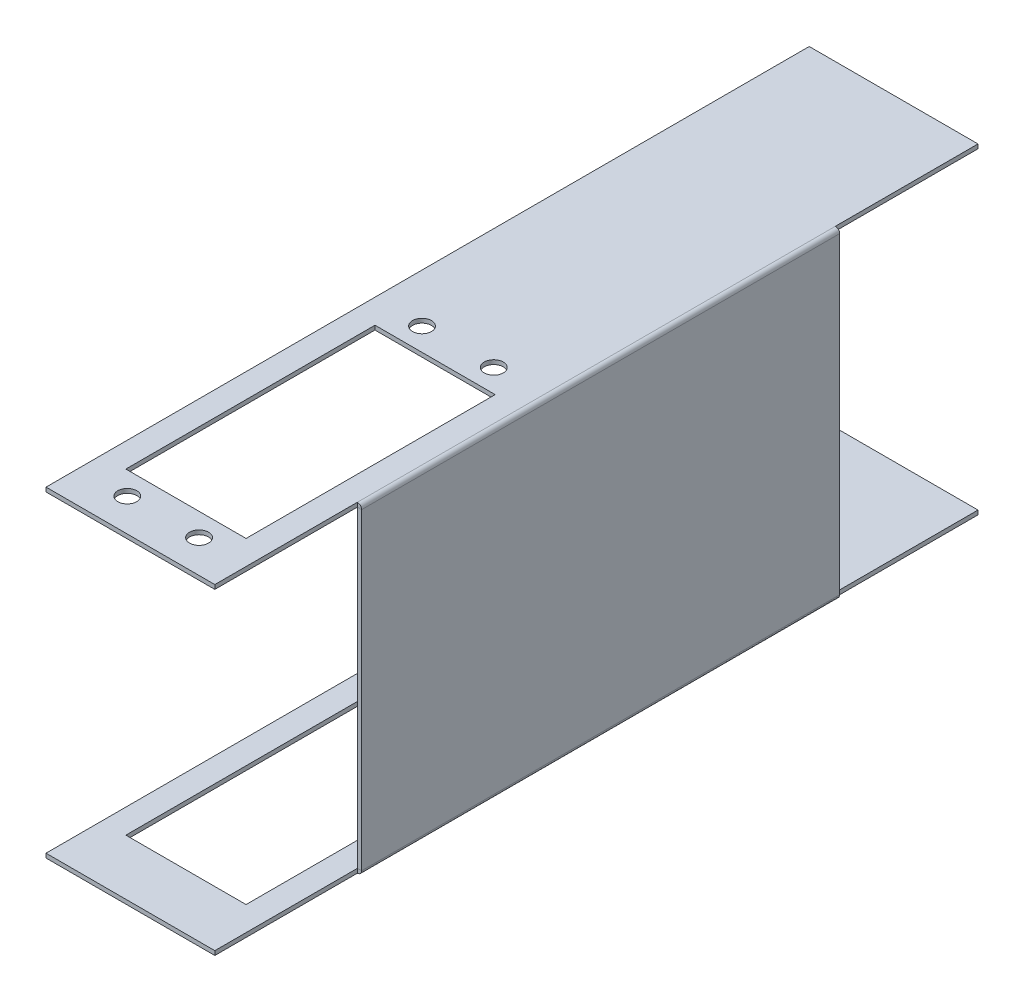
ISO-10303-21;
HEADER;
FILE_DESCRIPTION(('STEP AP214'),'2;1');
FILE_NAME('part.step','',(''),(''),'','','');
FILE_SCHEMA(('AUTOMOTIVE_DESIGN { 1 0 10303 214 1 1 1 1 }'));
ENDSEC;
DATA;
#1=APPLICATION_CONTEXT('core data for automotive mechanical design processes');
#2=APPLICATION_PROTOCOL_DEFINITION('international standard','automotive_design',2000,#1);
#3=PRODUCT_CONTEXT('',#1,'mechanical');
#4=PRODUCT('Part','Part','',(#3));
#5=PRODUCT_RELATED_PRODUCT_CATEGORY('part','',(#4));
#6=PRODUCT_DEFINITION_FORMATION('','',#4);
#7=PRODUCT_DEFINITION_CONTEXT('part definition',#1,'design');
#8=PRODUCT_DEFINITION('design','',#6,#7);
#9=PRODUCT_DEFINITION_SHAPE('','',#8);
#10=(LENGTH_UNIT() NAMED_UNIT(*) SI_UNIT(.MILLI.,.METRE.));
#11=(NAMED_UNIT(*) PLANE_ANGLE_UNIT() SI_UNIT($,.RADIAN.));
#12=(NAMED_UNIT(*) SI_UNIT($,.STERADIAN.) SOLID_ANGLE_UNIT());
#13=UNCERTAINTY_MEASURE_WITH_UNIT(LENGTH_MEASURE(1.E-05),#10,'distance_accuracy_value','');
#14=(GEOMETRIC_REPRESENTATION_CONTEXT(3) GLOBAL_UNCERTAINTY_ASSIGNED_CONTEXT((#13)) GLOBAL_UNIT_ASSIGNED_CONTEXT((#10,
#11,#12)) REPRESENTATION_CONTEXT('',''));
#15=CARTESIAN_POINT('',(0.,0.,0.));
#16=DIRECTION('',(0.,0.,1.));
#17=DIRECTION('',(1.,0.,0.));
#18=AXIS2_PLACEMENT_3D('',#15,#16,#17);
#19=CARTESIAN_POINT('',(0.,-1.,0.));
#20=DIRECTION('',(0.,1.,0.));
#21=DIRECTION('',(0.,0.,1.));
#22=AXIS2_PLACEMENT_3D('',#19,#20,#21);
#23=PLANE('',#22);
#24=CARTESIAN_POINT('',(-49.0605849108989,-0.999999999999999,12.8227115760057));
#25=DIRECTION('',(0.,1.,0.));
#26=DIRECTION('',(0.,0.,1.));
#27=AXIS2_PLACEMENT_3D('',#24,#25,#26);
#28=CIRCLE('',#27,2.25);
#29=CARTESIAN_POINT('',(-49.0605849108989,-0.999999999999999,15.0727115760057));
#30=VERTEX_POINT('',#29);
#31=EDGE_CURVE('E748',#30,#30,#28,.F.);
#32=ORIENTED_EDGE('',*,*,#31,.F.);
#33=EDGE_LOOP('',(#32));
#34=FACE_BOUND('',#33,.T.);
#35=CARTESIAN_POINT('',(-66.0605849108989,-0.999999999999999,82.6527115760057));
#36=DIRECTION('',(0.,1.,0.));
#37=DIRECTION('',(0.,0.,1.));
#38=AXIS2_PLACEMENT_3D('',#35,#36,#37);
#39=CIRCLE('',#38,2.25);
#40=CARTESIAN_POINT('',(-66.0605849108989,-0.999999999999999,84.9027115760057));
#41=VERTEX_POINT('',#40);
#42=EDGE_CURVE('E238',#41,#41,#39,.F.);
#43=ORIENTED_EDGE('',*,*,#42,.F.);
#44=EDGE_LOOP('',(#43));
#45=FACE_BOUND('',#44,.T.);
#46=DIRECTION('',(-1.,0.,0.));
#47=VECTOR('',#46,1.);
#48=CARTESIAN_POINT('',(0.,-1.,77.2527115760058));
#49=LINE('',#48,#47);
#50=CARTESIAN_POINT('',(-43.3205849108989,-1.,77.2527115760058));
#51=VERTEX_POINT('',#50);
#52=CARTESIAN_POINT('',(-71.8005849108989,-1.,77.2527115760058));
#53=VERTEX_POINT('',#52);
#54=EDGE_CURVE('E267',#51,#53,#49,.T.);
#55=ORIENTED_EDGE('',*,*,#54,.F.);
#56=DIRECTION('',(0.,0.,-1.));
#57=VECTOR('',#56,1.);
#58=CARTESIAN_POINT('',(-43.3205849108989,-1.,0.));
#59=LINE('',#58,#57);
#60=CARTESIAN_POINT('',(-43.3205849108989,-1.,18.2227115760058));
#61=VERTEX_POINT('',#60);
#62=EDGE_CURVE('E270',#51,#61,#59,.T.);
#63=ORIENTED_EDGE('',*,*,#62,.T.);
#64=DIRECTION('',(-1.,0.,0.));
#65=VECTOR('',#64,1.);
#66=CARTESIAN_POINT('',(0.,-1.,18.2227115760058));
#67=LINE('',#66,#65);
#68=CARTESIAN_POINT('',(-71.8005849108989,-1.,18.2227115760058));
#69=VERTEX_POINT('',#68);
#70=EDGE_CURVE('E258',#61,#69,#67,.T.);
#71=ORIENTED_EDGE('',*,*,#70,.T.);
#72=DIRECTION('',(0.,0.,-1.));
#73=VECTOR('',#72,1.);
#74=CARTESIAN_POINT('',(-71.8005849108989,-1.,0.));
#75=LINE('',#74,#73);
#76=EDGE_CURVE('E263',#53,#69,#75,.T.);
#77=ORIENTED_EDGE('',*,*,#76,.F.);
#78=EDGE_LOOP('',(#55,#63,#71,#77));
#79=FACE_BOUND('',#78,.T.);
#80=DIRECTION('',(0.,0.,-1.));
#81=VECTOR('',#80,1.);
#82=CARTESIAN_POINT('',(-37.5605849108988,-1.,0.));
#83=LINE('',#82,#81);
#84=CARTESIAN_POINT('',(-37.5605849108988,-1.,90.4126331400235));
#85=VERTEX_POINT('',#84);
#86=CARTESIAN_POINT('',(-37.5605849108988,-1.,56.6306009207806));
#87=VERTEX_POINT('',#86);
#88=EDGE_CURVE('E386',#85,#87,#83,.T.);
#89=ORIENTED_EDGE('',*,*,#88,.F.);
#90=DIRECTION('',(1.,0.,0.));
#91=VECTOR('',#90,1.);
#92=CARTESIAN_POINT('',(-77.5505849108986,-1.,90.4126331400235));
#93=LINE('',#92,#91);
#94=CARTESIAN_POINT('',(-77.5505849108986,-1.,90.4126331400235));
#95=VERTEX_POINT('',#94);
#96=EDGE_CURVE('E378',#95,#85,#93,.T.);
#97=ORIENTED_EDGE('',*,*,#96,.F.);
#98=DIRECTION('',(0.,0.,1.));
#99=VECTOR('',#98,1.);
#100=CARTESIAN_POINT('',(-77.5505849108988,-1.,-90.4126331400236));
#101=LINE('',#100,#99);
#102=CARTESIAN_POINT('',(-77.5505849108988,-1.,-90.4126331400236));
#103=VERTEX_POINT('',#102);
#104=EDGE_CURVE('E383',#103,#95,#101,.T.);
#105=ORIENTED_EDGE('',*,*,#104,.F.);
#106=DIRECTION('',(-1.,0.,0.));
#107=VECTOR('',#106,1.);
#108=CARTESIAN_POINT('',(-77.5505849108988,-1.,-90.4126331400236));
#109=LINE('',#108,#107);
#110=CARTESIAN_POINT('',(-37.5605849108985,-1.00000123367518,-90.4126331400234));
#111=VERTEX_POINT('',#110);
#112=EDGE_CURVE('E358',#111,#103,#109,.T.);
#113=ORIENTED_EDGE('',*,*,#112,.F.);
#114=DIRECTION('',(0.,0.,1.));
#115=VECTOR('',#114,1.);
#116=CARTESIAN_POINT('',(-37.5605849108985,-1.,0.));
#117=LINE('',#116,#115);
#118=CARTESIAN_POINT('',(-37.5605849108985,-1.,-56.6306009207806));
#119=VERTEX_POINT('',#118);
#120=EDGE_CURVE('E273',#111,#119,#117,.T.);
#121=ORIENTED_EDGE('',*,*,#120,.T.);
#122=EDGE_CURVE('E350',#87,#119,#83,.T.);
#123=ORIENTED_EDGE('',*,*,#122,.F.);
#124=EDGE_LOOP('',(#89,#97,#105,#113,#121,#123));
#125=FACE_BOUND('',#124,.T.);
#126=CARTESIAN_POINT('',(-49.0605849108989,-0.999999999999999,82.6527115760057));
#127=DIRECTION('',(0.,1.,0.));
#128=DIRECTION('',(0.,0.,1.));
#129=AXIS2_PLACEMENT_3D('',#126,#127,#128);
#130=CIRCLE('',#129,2.25);
#131=CARTESIAN_POINT('',(-49.0605849108989,-0.999999999999999,84.9027115760057));
#132=VERTEX_POINT('',#131);
#133=EDGE_CURVE('E757',#132,#132,#130,.F.);
#134=ORIENTED_EDGE('',*,*,#133,.F.);
#135=EDGE_LOOP('',(#134));
#136=FACE_BOUND('',#135,.T.);
#137=CARTESIAN_POINT('',(-66.0605849108989,-0.999999999999999,12.8227115760057));
#138=DIRECTION('',(0.,1.,0.));
#139=DIRECTION('',(0.,0.,1.));
#140=AXIS2_PLACEMENT_3D('',#137,#138,#139);
#141=CIRCLE('',#140,2.25);
#142=CARTESIAN_POINT('',(-66.0605849108989,-0.999999999999999,15.0727115760057));
#143=VERTEX_POINT('',#142);
#144=EDGE_CURVE('E743',#143,#143,#141,.F.);
#145=ORIENTED_EDGE('',*,*,#144,.F.);
#146=EDGE_LOOP('',(#145));
#147=FACE_BOUND('',#146,.T.);
#148=ADVANCED_FACE('F42',(#34,#45,#79,#125,#136,#147),#23,.F.);
#149=CARTESIAN_POINT('',(0.,0.,0.));
#150=DIRECTION('',(0.,1.,0.));
#151=DIRECTION('',(0.,0.,1.));
#152=AXIS2_PLACEMENT_3D('',#149,#150,#151);
#153=PLANE('',#152);
#154=CARTESIAN_POINT('',(-49.0605849108989,0.,12.8227115760057));
#155=DIRECTION('',(0.,-1.,0.));
#156=DIRECTION('',(0.,0.,-1.));
#157=AXIS2_PLACEMENT_3D('',#154,#155,#156);
#158=CIRCLE('',#157,2.25);
#159=CARTESIAN_POINT('',(-49.0605849108989,0.,10.5727115760058));
#160=VERTEX_POINT('',#159);
#161=EDGE_CURVE('E745',#160,#160,#158,.T.);
#162=ORIENTED_EDGE('',*,*,#161,.T.);
#163=EDGE_LOOP('',(#162));
#164=FACE_BOUND('',#163,.T.);
#165=CARTESIAN_POINT('',(-66.0605849108989,0.,82.6527115760057));
#166=DIRECTION('',(0.,-1.,0.));
#167=DIRECTION('',(0.,0.,-1.));
#168=AXIS2_PLACEMENT_3D('',#165,#166,#167);
#169=CIRCLE('',#168,2.25);
#170=CARTESIAN_POINT('',(-66.0605849108989,0.,80.4027115760057));
#171=VERTEX_POINT('',#170);
#172=EDGE_CURVE('E759',#171,#171,#169,.T.);
#173=ORIENTED_EDGE('',*,*,#172,.T.);
#174=EDGE_LOOP('',(#173));
#175=FACE_BOUND('',#174,.T.);
#176=DIRECTION('',(0.,0.,-1.));
#177=VECTOR('',#176,1.);
#178=CARTESIAN_POINT('',(-43.3205849108989,0.,77.2527115760058));
#179=LINE('',#178,#177);
#180=CARTESIAN_POINT('',(-43.3205849108989,0.,77.2527115760058));
#181=VERTEX_POINT('',#180);
#182=CARTESIAN_POINT('',(-43.3205849108989,0.,18.2227115760058));
#183=VERTEX_POINT('',#182);
#184=EDGE_CURVE('E67',#181,#183,#179,.T.);
#185=ORIENTED_EDGE('',*,*,#184,.F.);
#186=DIRECTION('',(-1.,0.,0.));
#187=VECTOR('',#186,1.);
#188=CARTESIAN_POINT('',(-43.3205849108989,0.,77.2527115760058));
#189=LINE('',#188,#187);
#190=CARTESIAN_POINT('',(-71.8005849108989,0.,77.2527115760058));
#191=VERTEX_POINT('',#190);
#192=EDGE_CURVE('E232',#181,#191,#189,.T.);
#193=ORIENTED_EDGE('',*,*,#192,.T.);
#194=DIRECTION('',(0.,0.,-1.));
#195=VECTOR('',#194,1.);
#196=CARTESIAN_POINT('',(-71.8005849108989,0.,77.2527115760058));
#197=LINE('',#196,#195);
#198=CARTESIAN_POINT('',(-71.8005849108989,0.,18.2227115760058));
#199=VERTEX_POINT('',#198);
#200=EDGE_CURVE('E235',#191,#199,#197,.T.);
#201=ORIENTED_EDGE('',*,*,#200,.T.);
#202=DIRECTION('',(-1.,0.,0.));
#203=VECTOR('',#202,1.);
#204=CARTESIAN_POINT('',(-43.3205849108989,0.,18.2227115760058));
#205=LINE('',#204,#203);
#206=EDGE_CURVE('E244',#183,#199,#205,.T.);
#207=ORIENTED_EDGE('',*,*,#206,.F.);
#208=EDGE_LOOP('',(#185,#193,#201,#207));
#209=FACE_BOUND('',#208,.T.);
#210=DIRECTION('',(1.,0.,0.));
#211=VECTOR('',#210,1.);
#212=CARTESIAN_POINT('',(-77.5505849108986,0.,90.4126331400235));
#213=LINE('',#212,#211);
#214=CARTESIAN_POINT('',(-77.5505849108986,0.,90.4126331400235));
#215=VERTEX_POINT('',#214);
#216=CARTESIAN_POINT('',(-37.5605849109008,0.,90.4126331400235));
#217=VERTEX_POINT('',#216);
#218=EDGE_CURVE('E372',#215,#217,#213,.T.);
#219=ORIENTED_EDGE('',*,*,#218,.T.);
#220=DIRECTION('',(0.,0.,-1.));
#221=VECTOR('',#220,1.);
#222=CARTESIAN_POINT('',(-37.5605849108988,0.,0.));
#223=LINE('',#222,#221);
#224=CARTESIAN_POINT('',(-37.5605849109001,0.,56.6306009207806));
#225=VERTEX_POINT('',#224);
#226=EDGE_CURVE('E368',#217,#225,#223,.T.);
#227=ORIENTED_EDGE('',*,*,#226,.T.);
#228=CARTESIAN_POINT('',(-37.5605849108757,0.,-56.6306009207806));
#229=VERTEX_POINT('',#228);
#230=EDGE_CURVE('E371',#225,#229,#223,.T.);
#231=ORIENTED_EDGE('',*,*,#230,.T.);
#232=DIRECTION('',(0.,0.,1.));
#233=VECTOR('',#232,1.);
#234=CARTESIAN_POINT('',(-37.5605849108756,0.,-73.521617030402));
#235=LINE('',#234,#233);
#236=CARTESIAN_POINT('',(-37.560584910875,0.,-90.4126331400234));
#237=VERTEX_POINT('',#236);
#238=EDGE_CURVE('E274',#237,#229,#235,.T.);
#239=ORIENTED_EDGE('',*,*,#238,.F.);
#240=DIRECTION('',(-1.,0.,0.));
#241=VECTOR('',#240,1.);
#242=CARTESIAN_POINT('',(-77.5505849108988,0.,-90.4126331400236));
#243=LINE('',#242,#241);
#244=CARTESIAN_POINT('',(-77.5505849108988,0.,-90.4126331400236));
#245=VERTEX_POINT('',#244);
#246=EDGE_CURVE('E366',#237,#245,#243,.T.);
#247=ORIENTED_EDGE('',*,*,#246,.T.);
#248=DIRECTION('',(0.,0.,1.));
#249=VECTOR('',#248,1.);
#250=CARTESIAN_POINT('',(-77.5505849108988,0.,-90.4126331400236));
#251=LINE('',#250,#249);
#252=EDGE_CURVE('E363',#245,#215,#251,.T.);
#253=ORIENTED_EDGE('',*,*,#252,.T.);
#254=EDGE_LOOP('',(#219,#227,#231,#239,#247,#253));
#255=FACE_BOUND('',#254,.T.);
#256=CARTESIAN_POINT('',(-49.0605849108989,0.,82.6527115760057));
#257=DIRECTION('',(0.,-1.,0.));
#258=DIRECTION('',(0.,0.,-1.));
#259=AXIS2_PLACEMENT_3D('',#256,#257,#258);
#260=CIRCLE('',#259,2.25);
#261=CARTESIAN_POINT('',(-49.0605849108989,0.,80.4027115760057));
#262=VERTEX_POINT('',#261);
#263=EDGE_CURVE('E754',#262,#262,#260,.T.);
#264=ORIENTED_EDGE('',*,*,#263,.T.);
#265=EDGE_LOOP('',(#264));
#266=FACE_BOUND('',#265,.T.);
#267=CARTESIAN_POINT('',(-66.0605849108989,0.,12.8227115760057));
#268=DIRECTION('',(0.,-1.,0.));
#269=DIRECTION('',(0.,0.,-1.));
#270=AXIS2_PLACEMENT_3D('',#267,#268,#269);
#271=CIRCLE('',#270,2.25);
#272=CARTESIAN_POINT('',(-66.0605849108989,0.,10.5727115760058));
#273=VERTEX_POINT('',#272);
#274=EDGE_CURVE('E740',#273,#273,#271,.T.);
#275=ORIENTED_EDGE('',*,*,#274,.T.);
#276=EDGE_LOOP('',(#275));
#277=FACE_BOUND('',#276,.T.);
#278=ADVANCED_FACE('F475',(#164,#175,#209,#255,#266,#277),#153,.T.);
#279=CARTESIAN_POINT('',(-37.5605849108988,-1.01,-180.830796396106));
#280=DIRECTION('',(0.,0.,1.));
#281=DIRECTION('',(1.,0.,0.));
#282=AXIS2_PLACEMENT_3D('',#279,#280,#281);
#283=CYLINDRICAL_SURFACE('',#282,0.01);
#284=ORIENTED_EDGE('',*,*,#122,.T.);
#285=CARTESIAN_POINT('',(-37.5605849108988,-1.01,-56.6306009207806));
#286=DIRECTION('',(0.,0.,-1.));
#287=DIRECTION('',(1.,0.,0.));
#288=AXIS2_PLACEMENT_3D('',#285,#286,#287);
#289=CIRCLE('',#288,0.0100000000000016);
#290=CARTESIAN_POINT('',(-37.5505849108988,-1.01,-56.6306009207806));
#291=VERTEX_POINT('',#290);
#292=EDGE_CURVE('E347',#119,#291,#289,.T.);
#293=ORIENTED_EDGE('',*,*,#292,.T.);
#294=DIRECTION('',(0.,0.,-1.));
#295=VECTOR('',#294,1.);
#296=CARTESIAN_POINT('',(-37.5505849108987,-1.01,0.));
#297=LINE('',#296,#295);
#298=CARTESIAN_POINT('',(-37.5505849108987,-1.01,56.6306009207806));
#299=VERTEX_POINT('',#298);
#300=EDGE_CURVE('E389',#299,#291,#297,.T.);
#301=ORIENTED_EDGE('',*,*,#300,.F.);
#302=CARTESIAN_POINT('',(-37.5605849108987,-1.01,56.6306009207806));
#303=DIRECTION('',(0.,0.,1.));
#304=DIRECTION('',(-1.,0.,0.));
#305=AXIS2_PLACEMENT_3D('',#302,#303,#304);
#306=CIRCLE('',#305,0.0100000000000016);
#307=EDGE_CURVE('E345',#299,#87,#306,.T.);
#308=ORIENTED_EDGE('',*,*,#307,.T.);
#309=EDGE_LOOP('',(#284,#293,#301,#308));
#310=FACE_BOUND('',#309,.T.);
#311=ADVANCED_FACE('F481',(#310),#283,.F.);
#312=CARTESIAN_POINT('',(-37.5605849108988,-1.01,-180.830796396106));
#313=DIRECTION('',(0.,0.,1.));
#314=DIRECTION('',(1.,0.,0.));
#315=AXIS2_PLACEMENT_3D('',#312,#313,#314);
#316=CYLINDRICAL_SURFACE('',#315,1.01);
#317=CARTESIAN_POINT('',(-37.5605849108988,-1.01,-56.6306009207806));
#318=DIRECTION('',(0.,0.,1.));
#319=DIRECTION('',(1.,0.,0.));
#320=AXIS2_PLACEMENT_3D('',#317,#318,#319);
#321=CIRCLE('',#320,1.01);
#322=CARTESIAN_POINT('',(-36.5505849108988,-1.01000000000004,-56.6306009207805));
#323=VERTEX_POINT('',#322);
#324=EDGE_CURVE('E348',#229,#323,#321,.F.);
#325=ORIENTED_EDGE('',*,*,#324,.F.);
#326=ORIENTED_EDGE('',*,*,#230,.F.);
#327=CARTESIAN_POINT('',(-37.5605849108987,-1.01,56.6306009207806));
#328=DIRECTION('',(0.,0.,1.));
#329=DIRECTION('',(1.,0.,0.));
#330=AXIS2_PLACEMENT_3D('',#327,#328,#329);
#331=CIRCLE('',#330,1.01);
#332=CARTESIAN_POINT('',(-36.5505849108987,-1.01000000000004,56.6306009207806));
#333=VERTEX_POINT('',#332);
#334=EDGE_CURVE('E341',#333,#225,#331,.T.);
#335=ORIENTED_EDGE('',*,*,#334,.F.);
#336=DIRECTION('',(0.,0.,-1.));
#337=VECTOR('',#336,1.);
#338=CARTESIAN_POINT('',(-36.5505849108988,-1.01,0.));
#339=LINE('',#338,#337);
#340=EDGE_CURVE('E395',#333,#323,#339,.T.);
#341=ORIENTED_EDGE('',*,*,#340,.T.);
#342=EDGE_LOOP('',(#325,#326,#335,#341));
#343=FACE_BOUND('',#342,.T.);
#344=ADVANCED_FACE('F531',(#343),#316,.T.);
#345=CARTESIAN_POINT('',(-36.5505849108989,-37.5705849108988,0.));
#346=DIRECTION('',(1.,0.,0.));
#347=DIRECTION('',(0.,0.,1.));
#348=AXIS2_PLACEMENT_3D('',#345,#346,#347);
#349=PLANE('',#348);
#350=DIRECTION('',(0.,-1.,0.));
#351=VECTOR('',#350,1.);
#352=CARTESIAN_POINT('',(-36.5505849108987,-0.0200000000000061,56.6306009207806));
#353=LINE('',#352,#351);
#354=CARTESIAN_POINT('',(-36.550584910899,-75.1111698217975,56.6306009207806));
#355=VERTEX_POINT('',#354);
#356=EDGE_CURVE('E357',#333,#355,#353,.T.);
#357=ORIENTED_EDGE('',*,*,#356,.T.);
#358=DIRECTION('',(0.,0.,-1.));
#359=VECTOR('',#358,1.);
#360=CARTESIAN_POINT('',(-36.550584910899,-75.1111698217975,0.));
#361=LINE('',#360,#359);
#362=CARTESIAN_POINT('',(-36.550584910899,-75.111169821796,-56.6306009207806));
#363=VERTEX_POINT('',#362);
#364=EDGE_CURVE('E51',#355,#363,#361,.T.);
#365=ORIENTED_EDGE('',*,*,#364,.T.);
#366=DIRECTION('',(0.,1.,0.));
#367=VECTOR('',#366,1.);
#368=CARTESIAN_POINT('',(-36.5505849108988,-0.0200000000000061,-56.6306009207806));
#369=LINE('',#368,#367);
#370=EDGE_CURVE('E409',#363,#323,#369,.T.);
#371=ORIENTED_EDGE('',*,*,#370,.T.);
#372=ORIENTED_EDGE('',*,*,#340,.F.);
#373=EDGE_LOOP('',(#357,#365,#371,#372));
#374=FACE_BOUND('',#373,.T.);
#375=ADVANCED_FACE('F44',(#374),#349,.T.);
#376=CARTESIAN_POINT('',(-37.5505849108987,-0.0199999999999992,56.6306009207806));
#377=DIRECTION('',(0.,0.,1.));
#378=DIRECTION('',(0.,-1.,0.));
#379=AXIS2_PLACEMENT_3D('',#376,#377,#378);
#380=PLANE('',#379);
#381=DIRECTION('',(0.,-1.,0.));
#382=VECTOR('',#381,1.);
#383=CARTESIAN_POINT('',(-37.5505849108987,-0.0199999999999992,56.6306009207806));
#384=LINE('',#383,#382);
#385=CARTESIAN_POINT('',(-37.550584910899,-75.1111698217974,56.6306009207806));
#386=VERTEX_POINT('',#385);
#387=EDGE_CURVE('E46',#299,#386,#384,.T.);
#388=ORIENTED_EDGE('',*,*,#387,.T.);
#389=DIRECTION('',(1.,0.,0.));
#390=VECTOR('',#389,1.);
#391=CARTESIAN_POINT('',(-37.550584910899,-75.1111698217974,56.6306009207806));
#392=LINE('',#391,#390);
#393=EDGE_CURVE('E12',#386,#355,#392,.T.);
#394=ORIENTED_EDGE('',*,*,#393,.T.);
#395=ORIENTED_EDGE('',*,*,#356,.F.);
#396=DIRECTION('',(1.,0.,0.));
#397=VECTOR('',#396,1.);
#398=CARTESIAN_POINT('',(-37.5505849108987,-1.01,56.6306009207806));
#399=LINE('',#398,#397);
#400=EDGE_CURVE('E392',#299,#333,#399,.T.);
#401=ORIENTED_EDGE('',*,*,#400,.F.);
#402=EDGE_LOOP('',(#388,#394,#395,#401));
#403=FACE_BOUND('',#402,.T.);
#404=ADVANCED_FACE('F419',(#403),#380,.T.);
#405=CARTESIAN_POINT('',(-37.5505849108988,-0.0199999999999992,-56.6306009207806));
#406=DIRECTION('',(0.,0.,-1.));
#407=DIRECTION('',(0.,1.,0.));
#408=AXIS2_PLACEMENT_3D('',#405,#406,#407);
#409=PLANE('',#408);
#410=ORIENTED_EDGE('',*,*,#370,.F.);
#411=DIRECTION('',(-1.,0.,0.));
#412=VECTOR('',#411,1.);
#413=CARTESIAN_POINT('',(-37.550584910899,-75.1111698217975,-56.6306009207806));
#414=LINE('',#413,#412);
#415=CARTESIAN_POINT('',(-37.550584910899,-75.1111698217975,-56.6306009207806));
#416=VERTEX_POINT('',#415);
#417=EDGE_CURVE('E402',#363,#416,#414,.T.);
#418=ORIENTED_EDGE('',*,*,#417,.T.);
#419=DIRECTION('',(0.,1.,0.));
#420=VECTOR('',#419,1.);
#421=CARTESIAN_POINT('',(-37.5505849108988,-0.0199999999999992,-56.6306009207806));
#422=LINE('',#421,#420);
#423=EDGE_CURVE('E393',#416,#291,#422,.T.);
#424=ORIENTED_EDGE('',*,*,#423,.T.);
#425=DIRECTION('',(-1.,0.,0.));
#426=VECTOR('',#425,1.);
#427=CARTESIAN_POINT('',(-37.5505849108988,-1.01,-56.6306009207806));
#428=LINE('',#427,#426);
#429=EDGE_CURVE('E397',#323,#291,#428,.T.);
#430=ORIENTED_EDGE('',*,*,#429,.F.);
#431=EDGE_LOOP('',(#410,#418,#424,#430));
#432=FACE_BOUND('',#431,.T.);
#433=ADVANCED_FACE('F436',(#432),#409,.T.);
#434=CARTESIAN_POINT('',(-37.5505849108989,-37.5705849108988,0.));
#435=DIRECTION('',(1.,0.,0.));
#436=DIRECTION('',(0.,0.,1.));
#437=AXIS2_PLACEMENT_3D('',#434,#435,#436);
#438=PLANE('',#437);
#439=DIRECTION('',(0.,0.,-1.));
#440=VECTOR('',#439,1.);
#441=CARTESIAN_POINT('',(-37.550584910899,-75.1111698217975,0.));
#442=LINE('',#441,#440);
#443=EDGE_CURVE('E400',#386,#416,#442,.T.);
#444=ORIENTED_EDGE('',*,*,#443,.F.);
#445=ORIENTED_EDGE('',*,*,#387,.F.);
#446=ORIENTED_EDGE('',*,*,#300,.T.);
#447=ORIENTED_EDGE('',*,*,#423,.F.);
#448=EDGE_LOOP('',(#444,#445,#446,#447));
#449=FACE_BOUND('',#448,.T.);
#450=ADVANCED_FACE('F432',(#449),#438,.F.);
#451=CARTESIAN_POINT('',(-77.5505849108988,-1.,-90.4126331400236));
#452=DIRECTION('',(-1.,0.,0.));
#453=DIRECTION('',(0.,0.,1.));
#454=AXIS2_PLACEMENT_3D('',#451,#452,#453);
#455=PLANE('',#454);
#456=ORIENTED_EDGE('',*,*,#252,.F.);
#457=DIRECTION('',(0.,1.,0.));
#458=VECTOR('',#457,1.);
#459=CARTESIAN_POINT('',(-77.5505849108988,-1.,-90.4126331400236));
#460=LINE('',#459,#458);
#461=EDGE_CURVE('E354',#103,#245,#460,.T.);
#462=ORIENTED_EDGE('',*,*,#461,.F.);
#463=ORIENTED_EDGE('',*,*,#104,.T.);
#464=DIRECTION('',(0.,1.,0.));
#465=VECTOR('',#464,1.);
#466=CARTESIAN_POINT('',(-77.5505849108986,-1.,90.4126331400235));
#467=LINE('',#466,#465);
#468=EDGE_CURVE('E381',#95,#215,#467,.T.);
#469=ORIENTED_EDGE('',*,*,#468,.T.);
#470=EDGE_LOOP('',(#456,#462,#463,#469));
#471=FACE_BOUND('',#470,.T.);
#472=ADVANCED_FACE('F488',(#471),#455,.T.);
#473=CARTESIAN_POINT('',(-77.5505849108986,-1.,90.4126331400235));
#474=DIRECTION('',(0.,0.,1.));
#475=DIRECTION('',(1.,0.,0.));
#476=AXIS2_PLACEMENT_3D('',#473,#474,#475);
#477=PLANE('',#476);
#478=ORIENTED_EDGE('',*,*,#96,.T.);
#479=DIRECTION('',(0.,1.,0.));
#480=VECTOR('',#479,1.);
#481=CARTESIAN_POINT('',(-37.5605849108987,-1.,90.4126331400235));
#482=LINE('',#481,#480);
#483=EDGE_CURVE('E375',#85,#217,#482,.T.);
#484=ORIENTED_EDGE('',*,*,#483,.T.);
#485=ORIENTED_EDGE('',*,*,#218,.F.);
#486=ORIENTED_EDGE('',*,*,#468,.F.);
#487=EDGE_LOOP('',(#478,#484,#485,#486));
#488=FACE_BOUND('',#487,.T.);
#489=ADVANCED_FACE('F490',(#488),#477,.T.);
#490=CARTESIAN_POINT('',(-77.5505849108988,-1.,-90.4126331400236));
#491=DIRECTION('',(0.,0.,-1.));
#492=DIRECTION('',(-1.,0.,0.));
#493=AXIS2_PLACEMENT_3D('',#490,#491,#492);
#494=PLANE('',#493);
#495=ORIENTED_EDGE('',*,*,#246,.F.);
#496=DIRECTION('',(0.,-1.,0.));
#497=VECTOR('',#496,1.);
#498=CARTESIAN_POINT('',(-37.5605849108988,-1.,-90.4126331400234));
#499=LINE('',#498,#497);
#500=EDGE_CURVE('E360',#237,#111,#499,.T.);
#501=ORIENTED_EDGE('',*,*,#500,.T.);
#502=ORIENTED_EDGE('',*,*,#112,.T.);
#503=ORIENTED_EDGE('',*,*,#461,.T.);
#504=EDGE_LOOP('',(#495,#501,#502,#503));
#505=FACE_BOUND('',#504,.T.);
#506=ADVANCED_FACE('F492',(#505),#494,.T.);
#507=CARTESIAN_POINT('',(-37.5605849108987,-1.01,56.6306009207806));
#508=DIRECTION('',(0.,0.,-1.));
#509=DIRECTION('',(-1.,0.,0.));
#510=AXIS2_PLACEMENT_3D('',#507,#508,#509);
#511=PLANE('',#510);
#512=ORIENTED_EDGE('',*,*,#400,.T.);
#513=ORIENTED_EDGE('',*,*,#334,.T.);
#514=DIRECTION('',(1.30399510801919E-12,-1.,0.));
#515=VECTOR('',#514,1.);
#516=CARTESIAN_POINT('',(-37.5605849108988,-1.,56.6306009207806));
#517=LINE('',#516,#515);
#518=EDGE_CURVE('E282',#87,#225,#517,.F.);
#519=ORIENTED_EDGE('',*,*,#518,.F.);
#520=ORIENTED_EDGE('',*,*,#307,.F.);
#521=EDGE_LOOP('',(#512,#513,#519,#520));
#522=FACE_BOUND('',#521,.T.);
#523=ADVANCED_FACE('F497',(#522),#511,.F.);
#524=CARTESIAN_POINT('',(-37.5605849108988,-1.01,-56.6306009207806));
#525=DIRECTION('',(0.,0.,1.));
#526=DIRECTION('',(1.,0.,0.));
#527=AXIS2_PLACEMENT_3D('',#524,#525,#526);
#528=PLANE('',#527);
#529=ORIENTED_EDGE('',*,*,#324,.T.);
#530=ORIENTED_EDGE('',*,*,#429,.T.);
#531=ORIENTED_EDGE('',*,*,#292,.F.);
#532=DIRECTION('',(-2.28143115584046E-11,-1.,0.));
#533=VECTOR('',#532,1.);
#534=CARTESIAN_POINT('',(-37.5605849108985,-1.,-56.6306009207806));
#535=LINE('',#534,#533);
#536=EDGE_CURVE('E277',#119,#229,#535,.F.);
#537=ORIENTED_EDGE('',*,*,#536,.T.);
#538=EDGE_LOOP('',(#529,#530,#531,#537));
#539=FACE_BOUND('',#538,.T.);
#540=ADVANCED_FACE('F536',(#539),#528,.F.);
#541=CARTESIAN_POINT('',(-37.560584910899,-75.1111698217975,56.6306009207806));
#542=DIRECTION('',(0.,0.,-1.));
#543=DIRECTION('',(-1.,0.,0.));
#544=AXIS2_PLACEMENT_3D('',#541,#542,#543);
#545=PLANE('',#544);
#546=DIRECTION('',(0.,-1.,0.));
#547=VECTOR('',#546,1.);
#548=CARTESIAN_POINT('',(-37.560584910899,-75.1211698217975,56.6306009207806));
#549=LINE('',#548,#547);
#550=CARTESIAN_POINT('',(-37.560584910899,-75.1211698217975,56.6306009207806));
#551=VERTEX_POINT('',#550);
#552=CARTESIAN_POINT('',(-37.560584910899,-76.1211698217975,56.6306009207806));
#553=VERTEX_POINT('',#552);
#554=EDGE_CURVE('E285',#551,#553,#549,.T.);
#555=ORIENTED_EDGE('',*,*,#554,.T.);
#556=CARTESIAN_POINT('',(-37.560584910899,-75.1111698217975,56.6306009207806));
#557=DIRECTION('',(0.,0.,1.));
#558=DIRECTION('',(1.,0.,0.));
#559=AXIS2_PLACEMENT_3D('',#556,#557,#558);
#560=CIRCLE('',#559,1.01);
#561=EDGE_CURVE('E288',#553,#355,#560,.T.);
#562=ORIENTED_EDGE('',*,*,#561,.T.);
#563=ORIENTED_EDGE('',*,*,#393,.F.);
#564=CARTESIAN_POINT('',(-37.560584910899,-75.1111698217975,56.6306009207806));
#565=DIRECTION('',(0.,0.,1.));
#566=DIRECTION('',(-1.,0.,0.));
#567=AXIS2_PLACEMENT_3D('',#564,#565,#566);
#568=CIRCLE('',#567,0.00999999999999959);
#569=EDGE_CURVE('E334',#551,#386,#568,.T.);
#570=ORIENTED_EDGE('',*,*,#569,.F.);
#571=EDGE_LOOP('',(#555,#562,#563,#570));
#572=FACE_BOUND('',#571,.T.);
#573=ADVANCED_FACE('F423',(#572),#545,.F.);
#574=CARTESIAN_POINT('',(-37.560584910899,-75.1111698217975,-56.6306009207806));
#575=DIRECTION('',(0.,0.,1.));
#576=DIRECTION('',(1.,0.,0.));
#577=AXIS2_PLACEMENT_3D('',#574,#575,#576);
#578=PLANE('',#577);
#579=CARTESIAN_POINT('',(-37.560584910899,-75.1111698217975,-56.6306009207806));
#580=DIRECTION('',(0.,0.,1.));
#581=DIRECTION('',(1.,0.,0.));
#582=AXIS2_PLACEMENT_3D('',#579,#580,#581);
#583=CIRCLE('',#582,1.01);
#584=CARTESIAN_POINT('',(-37.560584910899,-76.1211698217975,-56.6306009207806));
#585=VERTEX_POINT('',#584);
#586=EDGE_CURVE('E338',#363,#585,#583,.F.);
#587=ORIENTED_EDGE('',*,*,#586,.T.);
#588=DIRECTION('',(0.,-1.,0.));
#589=VECTOR('',#588,1.);
#590=CARTESIAN_POINT('',(-37.560584910899,-75.1211698217975,-56.6306009207806));
#591=LINE('',#590,#589);
#592=CARTESIAN_POINT('',(-37.560584910899,-75.1211698217975,-56.6306009207806));
#593=VERTEX_POINT('',#592);
#594=EDGE_CURVE('E306',#593,#585,#591,.T.);
#595=ORIENTED_EDGE('',*,*,#594,.F.);
#596=CARTESIAN_POINT('',(-37.560584910899,-75.1111698217975,-56.6306009207806));
#597=DIRECTION('',(0.,0.,-1.));
#598=DIRECTION('',(1.,0.,0.));
#599=AXIS2_PLACEMENT_3D('',#596,#597,#598);
#600=CIRCLE('',#599,0.00999999999999959);
#601=EDGE_CURVE('E337',#416,#593,#600,.T.);
#602=ORIENTED_EDGE('',*,*,#601,.F.);
#603=ORIENTED_EDGE('',*,*,#417,.F.);
#604=EDGE_LOOP('',(#587,#595,#602,#603));
#605=FACE_BOUND('',#604,.T.);
#606=ADVANCED_FACE('F439',(#605),#578,.F.);
#607=CARTESIAN_POINT('',(-37.560584910899,-75.1111698217975,-113.265616771352));
#608=DIRECTION('',(0.,0.,1.));
#609=DIRECTION('',(1.,0.,0.));
#610=AXIS2_PLACEMENT_3D('',#607,#608,#609);
#611=CYLINDRICAL_SURFACE('',#610,0.01);
#612=ORIENTED_EDGE('',*,*,#443,.T.);
#613=ORIENTED_EDGE('',*,*,#601,.T.);
#614=DIRECTION('',(0.,0.,-1.));
#615=VECTOR('',#614,1.);
#616=CARTESIAN_POINT('',(-37.560584910899,-75.1211698217975,0.));
#617=LINE('',#616,#615);
#618=EDGE_CURVE('E312',#551,#593,#617,.T.);
#619=ORIENTED_EDGE('',*,*,#618,.F.);
#620=ORIENTED_EDGE('',*,*,#569,.T.);
#621=EDGE_LOOP('',(#612,#613,#619,#620));
#622=FACE_BOUND('',#621,.T.);
#623=ADVANCED_FACE('F428',(#622),#611,.F.);
#624=CARTESIAN_POINT('',(-37.560584910899,-75.1111698217975,-113.265616771352));
#625=DIRECTION('',(0.,0.,1.));
#626=DIRECTION('',(1.,0.,0.));
#627=AXIS2_PLACEMENT_3D('',#624,#625,#626);
#628=CYLINDRICAL_SURFACE('',#627,1.01);
#629=ORIENTED_EDGE('',*,*,#364,.F.);
#630=ORIENTED_EDGE('',*,*,#561,.F.);
#631=DIRECTION('',(0.,0.,-1.));
#632=VECTOR('',#631,1.);
#633=CARTESIAN_POINT('',(-37.560584910899,-76.1211698217975,0.));
#634=LINE('',#633,#632);
#635=EDGE_CURVE('E329',#553,#585,#634,.T.);
#636=ORIENTED_EDGE('',*,*,#635,.T.);
#637=ORIENTED_EDGE('',*,*,#586,.F.);
#638=EDGE_LOOP('',(#629,#630,#636,#637));
#639=FACE_BOUND('',#638,.T.);
#640=ADVANCED_FACE('F442',(#639),#628,.T.);
#641=CARTESIAN_POINT('',(-37.560584910899,-75.1211698217975,90.4126331400235));
#642=DIRECTION('',(0.,0.,1.));
#643=DIRECTION('',(-1.,0.,0.));
#644=AXIS2_PLACEMENT_3D('',#641,#642,#643);
#645=PLANE('',#644);
#646=DIRECTION('',(-1.,0.,0.));
#647=VECTOR('',#646,1.);
#648=CARTESIAN_POINT('',(-37.560584910899,-76.1211698217975,90.4126331400235));
#649=LINE('',#648,#647);
#650=CARTESIAN_POINT('',(-37.560584910899,-76.1211698217975,90.4126331400235));
#651=VERTEX_POINT('',#650);
#652=CARTESIAN_POINT('',(-77.5605849108989,-76.1211698217972,90.4126331400235));
#653=VERTEX_POINT('',#652);
#654=EDGE_CURVE('E300',#651,#653,#649,.T.);
#655=ORIENTED_EDGE('',*,*,#654,.F.);
#656=DIRECTION('',(0.,-1.,0.));
#657=VECTOR('',#656,1.);
#658=CARTESIAN_POINT('',(-37.560584910899,-75.1211698217975,90.4126331400235));
#659=LINE('',#658,#657);
#660=CARTESIAN_POINT('',(-37.560584910899,-75.1211698217975,90.4126331400235));
#661=VERTEX_POINT('',#660);
#662=EDGE_CURVE('E286',#661,#651,#659,.T.);
#663=ORIENTED_EDGE('',*,*,#662,.F.);
#664=DIRECTION('',(-1.,0.,0.));
#665=VECTOR('',#664,1.);
#666=CARTESIAN_POINT('',(-37.560584910899,-75.1211698217975,90.4126331400235));
#667=LINE('',#666,#665);
#668=CARTESIAN_POINT('',(-77.5605849108989,-75.1211698217972,90.4126331400235));
#669=VERTEX_POINT('',#668);
#670=EDGE_CURVE('E326',#661,#669,#667,.T.);
#671=ORIENTED_EDGE('',*,*,#670,.T.);
#672=DIRECTION('',(0.,-1.,0.));
#673=VECTOR('',#672,1.);
#674=CARTESIAN_POINT('',(-77.5605849108989,-75.1211698217972,90.4126331400235));
#675=LINE('',#674,#673);
#676=EDGE_CURVE('E324',#669,#653,#675,.T.);
#677=ORIENTED_EDGE('',*,*,#676,.T.);
#678=EDGE_LOOP('',(#655,#663,#671,#677));
#679=FACE_BOUND('',#678,.T.);
#680=ADVANCED_FACE('F456',(#679),#645,.T.);
#681=CARTESIAN_POINT('',(-77.5605849108989,-75.1211698217972,-90.4126331400235));
#682=DIRECTION('',(-1.,0.,0.));
#683=DIRECTION('',(0.,0.,-1.));
#684=AXIS2_PLACEMENT_3D('',#681,#682,#683);
#685=PLANE('',#684);
#686=DIRECTION('',(0.,0.,-1.));
#687=VECTOR('',#686,1.);
#688=CARTESIAN_POINT('',(-77.5605849108989,-76.1211698217972,-90.4126331400235));
#689=LINE('',#688,#687);
#690=CARTESIAN_POINT('',(-77.5605849108989,-76.1211698217972,-90.4126331400235));
#691=VERTEX_POINT('',#690);
#692=EDGE_CURVE('E297',#653,#691,#689,.T.);
#693=ORIENTED_EDGE('',*,*,#692,.F.);
#694=ORIENTED_EDGE('',*,*,#676,.F.);
#695=DIRECTION('',(0.,0.,-1.));
#696=VECTOR('',#695,1.);
#697=CARTESIAN_POINT('',(-77.5605849108989,-75.1211698217972,-90.4126331400235));
#698=LINE('',#697,#696);
#699=CARTESIAN_POINT('',(-77.5605849108989,-75.1211698217972,-90.4126331400235));
#700=VERTEX_POINT('',#699);
#701=EDGE_CURVE('E321',#669,#700,#698,.T.);
#702=ORIENTED_EDGE('',*,*,#701,.T.);
#703=DIRECTION('',(0.,-1.,0.));
#704=VECTOR('',#703,1.);
#705=CARTESIAN_POINT('',(-77.5605849108989,-75.1211698217972,-90.4126331400235));
#706=LINE('',#705,#704);
#707=EDGE_CURVE('E319',#700,#691,#706,.T.);
#708=ORIENTED_EDGE('',*,*,#707,.T.);
#709=EDGE_LOOP('',(#693,#694,#702,#708));
#710=FACE_BOUND('',#709,.T.);
#711=ADVANCED_FACE('F460',(#710),#685,.T.);
#712=CARTESIAN_POINT('',(-37.5605849108991,-75.1211698217975,-90.4126331400234));
#713=DIRECTION('',(0.,0.,-1.));
#714=DIRECTION('',(1.,0.,0.));
#715=AXIS2_PLACEMENT_3D('',#712,#713,#714);
#716=PLANE('',#715);
#717=DIRECTION('',(1.,0.,0.));
#718=VECTOR('',#717,1.);
#719=CARTESIAN_POINT('',(-37.5605849108991,-76.1211698217975,-90.4126331400234));
#720=LINE('',#719,#718);
#721=CARTESIAN_POINT('',(-37.5605849108991,-76.1211698217975,-90.4126331400234));
#722=VERTEX_POINT('',#721);
#723=EDGE_CURVE('E294',#691,#722,#720,.T.);
#724=ORIENTED_EDGE('',*,*,#723,.F.);
#725=ORIENTED_EDGE('',*,*,#707,.F.);
#726=DIRECTION('',(1.,0.,0.));
#727=VECTOR('',#726,1.);
#728=CARTESIAN_POINT('',(-37.5605849108991,-75.1211698217975,-90.4126331400234));
#729=LINE('',#728,#727);
#730=CARTESIAN_POINT('',(-37.5605849108991,-75.1211698217975,-90.4126331400234));
#731=VERTEX_POINT('',#730);
#732=EDGE_CURVE('E316',#700,#731,#729,.T.);
#733=ORIENTED_EDGE('',*,*,#732,.T.);
#734=DIRECTION('',(0.,-1.,0.));
#735=VECTOR('',#734,1.);
#736=CARTESIAN_POINT('',(-37.5605849108991,-75.1211698217975,-90.4126331400234));
#737=LINE('',#736,#735);
#738=EDGE_CURVE('E314',#731,#722,#737,.T.);
#739=ORIENTED_EDGE('',*,*,#738,.T.);
#740=EDGE_LOOP('',(#724,#725,#733,#739));
#741=FACE_BOUND('',#740,.T.);
#742=ADVANCED_FACE('F462',(#741),#716,.T.);
#743=CARTESIAN_POINT('',(-0.0100000000003014,-75.1211698217977,0.));
#744=DIRECTION('',(0.,-1.,0.));
#745=DIRECTION('',(0.,0.,1.));
#746=AXIS2_PLACEMENT_3D('',#743,#744,#745);
#747=PLANE('',#746);
#748=DIRECTION('',(1.,0.,0.));
#749=VECTOR('',#748,1.);
#750=CARTESIAN_POINT('',(-0.0100000000003103,-75.1211698217977,18.2227115760058));
#751=LINE('',#750,#749);
#752=CARTESIAN_POINT('',(-71.8005849108989,-75.1211698217973,18.2227115760058));
#753=VERTEX_POINT('',#752);
#754=CARTESIAN_POINT('',(-43.3205849108989,-75.1211698217974,18.2227115760058));
#755=VERTEX_POINT('',#754);
#756=EDGE_CURVE('E250',#753,#755,#751,.T.);
#757=ORIENTED_EDGE('',*,*,#756,.T.);
#758=DIRECTION('',(0.,0.,1.));
#759=VECTOR('',#758,1.);
#760=CARTESIAN_POINT('',(-43.3205849108989,-75.1211698217974,0.));
#761=LINE('',#760,#759);
#762=CARTESIAN_POINT('',(-43.3205849108989,-75.1211698217973,77.2527115760058));
#763=VERTEX_POINT('',#762);
#764=EDGE_CURVE('E214',#755,#763,#761,.T.);
#765=ORIENTED_EDGE('',*,*,#764,.T.);
#766=DIRECTION('',(1.,0.,0.));
#767=VECTOR('',#766,1.);
#768=CARTESIAN_POINT('',(-0.0100000000003014,-75.1211698217977,77.2527115760058));
#769=LINE('',#768,#767);
#770=CARTESIAN_POINT('',(-71.8005849108989,-75.1211698217972,77.2527115760058));
#771=VERTEX_POINT('',#770);
#772=EDGE_CURVE('E265',#771,#763,#769,.T.);
#773=ORIENTED_EDGE('',*,*,#772,.F.);
#774=DIRECTION('',(0.,0.,1.));
#775=VECTOR('',#774,1.);
#776=CARTESIAN_POINT('',(-71.8005849108989,-75.1211698217972,0.));
#777=LINE('',#776,#775);
#778=EDGE_CURVE('E261',#753,#771,#777,.T.);
#779=ORIENTED_EDGE('',*,*,#778,.F.);
#780=EDGE_LOOP('',(#757,#765,#773,#779));
#781=FACE_BOUND('',#780,.T.);
#782=DIRECTION('',(0.,0.,1.));
#783=VECTOR('',#782,1.);
#784=CARTESIAN_POINT('',(-37.560584910899,-75.1211698217975,56.6306009207806));
#785=LINE('',#784,#783);
#786=EDGE_CURVE('E289',#551,#661,#785,.T.);
#787=ORIENTED_EDGE('',*,*,#786,.F.);
#788=ORIENTED_EDGE('',*,*,#618,.T.);
#789=DIRECTION('',(0.,0.,1.));
#790=VECTOR('',#789,1.);
#791=CARTESIAN_POINT('',(-37.5605849108991,-75.1211698217975,-90.4126331400234));
#792=LINE('',#791,#790);
#793=EDGE_CURVE('E309',#731,#593,#792,.T.);
#794=ORIENTED_EDGE('',*,*,#793,.F.);
#795=ORIENTED_EDGE('',*,*,#732,.F.);
#796=ORIENTED_EDGE('',*,*,#701,.F.);
#797=ORIENTED_EDGE('',*,*,#670,.F.);
#798=EDGE_LOOP('',(#787,#788,#794,#795,#796,#797));
#799=FACE_BOUND('',#798,.T.);
#800=ADVANCED_FACE('F450',(#781,#799),#747,.F.);
#801=CARTESIAN_POINT('',(-37.5605849108991,-75.1211698217975,-90.4126331400234));
#802=DIRECTION('',(1.,0.,0.));
#803=DIRECTION('',(0.,0.,1.));
#804=AXIS2_PLACEMENT_3D('',#801,#802,#803);
#805=PLANE('',#804);
#806=DIRECTION('',(0.,0.,1.));
#807=VECTOR('',#806,1.);
#808=CARTESIAN_POINT('',(-37.5605849108991,-76.1211698217975,-90.4126331400234));
#809=LINE('',#808,#807);
#810=EDGE_CURVE('E292',#722,#585,#809,.T.);
#811=ORIENTED_EDGE('',*,*,#810,.F.);
#812=ORIENTED_EDGE('',*,*,#738,.F.);
#813=ORIENTED_EDGE('',*,*,#793,.T.);
#814=ORIENTED_EDGE('',*,*,#594,.T.);
#815=EDGE_LOOP('',(#811,#812,#813,#814));
#816=FACE_BOUND('',#815,.T.);
#817=ADVANCED_FACE('F464',(#816),#805,.T.);
#818=CARTESIAN_POINT('',(-0.0100000000003153,-76.1211698217977,0.));
#819=DIRECTION('',(0.,-1.,0.));
#820=DIRECTION('',(0.,0.,1.));
#821=AXIS2_PLACEMENT_3D('',#818,#819,#820);
#822=PLANE('',#821);
#823=DIRECTION('',(0.,0.,-1.));
#824=VECTOR('',#823,1.);
#825=CARTESIAN_POINT('',(-43.3205849108989,-76.1211698217975,77.2527115760058));
#826=LINE('',#825,#824);
#827=CARTESIAN_POINT('',(-43.3205849108989,-76.1211698217975,77.2527115760058));
#828=VERTEX_POINT('',#827);
#829=CARTESIAN_POINT('',(-43.3205849108989,-76.1211698217975,18.2227115760058));
#830=VERTEX_POINT('',#829);
#831=EDGE_CURVE('E211',#828,#830,#826,.T.);
#832=ORIENTED_EDGE('',*,*,#831,.T.);
#833=DIRECTION('',(-1.,0.,0.));
#834=VECTOR('',#833,1.);
#835=CARTESIAN_POINT('',(-43.3205849108989,-76.1211698217975,18.2227115760058));
#836=LINE('',#835,#834);
#837=CARTESIAN_POINT('',(-71.8005849108989,-76.1211698217972,18.2227115760058));
#838=VERTEX_POINT('',#837);
#839=EDGE_CURVE('E220',#830,#838,#836,.T.);
#840=ORIENTED_EDGE('',*,*,#839,.T.);
#841=DIRECTION('',(0.,0.,-1.));
#842=VECTOR('',#841,1.);
#843=CARTESIAN_POINT('',(-71.8005849108989,-76.1211698217975,77.2527115760058));
#844=LINE('',#843,#842);
#845=CARTESIAN_POINT('',(-71.8005849108989,-76.1211698217975,77.2527115760058));
#846=VERTEX_POINT('',#845);
#847=EDGE_CURVE('E227',#846,#838,#844,.T.);
#848=ORIENTED_EDGE('',*,*,#847,.F.);
#849=DIRECTION('',(-1.,0.,0.));
#850=VECTOR('',#849,1.);
#851=CARTESIAN_POINT('',(-43.3205849108989,-76.1211698217975,77.2527115760058));
#852=LINE('',#851,#850);
#853=EDGE_CURVE('E231',#828,#846,#852,.T.);
#854=ORIENTED_EDGE('',*,*,#853,.F.);
#855=EDGE_LOOP('',(#832,#840,#848,#854));
#856=FACE_BOUND('',#855,.T.);
#857=ORIENTED_EDGE('',*,*,#635,.F.);
#858=DIRECTION('',(0.,0.,1.));
#859=VECTOR('',#858,1.);
#860=CARTESIAN_POINT('',(-37.560584910899,-76.1211698217975,56.6306009207806));
#861=LINE('',#860,#859);
#862=EDGE_CURVE('E303',#553,#651,#861,.T.);
#863=ORIENTED_EDGE('',*,*,#862,.T.);
#864=ORIENTED_EDGE('',*,*,#654,.T.);
#865=ORIENTED_EDGE('',*,*,#692,.T.);
#866=ORIENTED_EDGE('',*,*,#723,.T.);
#867=ORIENTED_EDGE('',*,*,#810,.T.);
#868=EDGE_LOOP('',(#857,#863,#864,#865,#866,#867));
#869=FACE_BOUND('',#868,.T.);
#870=ADVANCED_FACE('F229',(#856,#869),#822,.T.);
#871=CARTESIAN_POINT('',(-37.560584910899,-75.1211698217975,56.6306009207806));
#872=DIRECTION('',(1.,0.,0.));
#873=DIRECTION('',(0.,0.,1.));
#874=AXIS2_PLACEMENT_3D('',#871,#872,#873);
#875=PLANE('',#874);
#876=ORIENTED_EDGE('',*,*,#862,.F.);
#877=ORIENTED_EDGE('',*,*,#554,.F.);
#878=ORIENTED_EDGE('',*,*,#786,.T.);
#879=ORIENTED_EDGE('',*,*,#662,.T.);
#880=EDGE_LOOP('',(#876,#877,#878,#879));
#881=FACE_BOUND('',#880,.T.);
#882=ADVANCED_FACE('F447',(#881),#875,.T.);
#883=CARTESIAN_POINT('',(-37.5605849108987,-1.,73.521617030402));
#884=DIRECTION('',(1.,0.,0.));
#885=DIRECTION('',(0.,0.,-1.));
#886=AXIS2_PLACEMENT_3D('',#883,#884,#885);
#887=PLANE('',#886);
#888=ORIENTED_EDGE('',*,*,#483,.F.);
#889=ORIENTED_EDGE('',*,*,#88,.T.);
#890=ORIENTED_EDGE('',*,*,#518,.T.);
#891=ORIENTED_EDGE('',*,*,#226,.F.);
#892=EDGE_LOOP('',(#888,#889,#890,#891));
#893=FACE_BOUND('',#892,.T.);
#894=ADVANCED_FACE('F526',(#893),#887,.T.);
#895=CARTESIAN_POINT('',(-37.5605849108985,-1.,-73.521617030402));
#896=DIRECTION('',(-1.,2.28983498828938E-11,0.));
#897=DIRECTION('',(0.,0.,1.));
#898=AXIS2_PLACEMENT_3D('',#895,#896,#897);
#899=PLANE('',#898);
#900=ORIENTED_EDGE('',*,*,#536,.F.);
#901=ORIENTED_EDGE('',*,*,#120,.F.);
#902=ORIENTED_EDGE('',*,*,#500,.F.);
#903=ORIENTED_EDGE('',*,*,#238,.T.);
#904=EDGE_LOOP('',(#900,#901,#902,#903));
#905=FACE_BOUND('',#904,.T.);
#906=ADVANCED_FACE('F535',(#905),#899,.F.);
#907=CARTESIAN_POINT('',(-43.3205849108989,-76.1211698217975,18.2227115760058));
#908=DIRECTION('',(0.,0.,-1.));
#909=DIRECTION('',(-1.,0.,0.));
#910=AXIS2_PLACEMENT_3D('',#907,#908,#909);
#911=PLANE('',#910);
#912=DIRECTION('',(0.,1.,0.));
#913=VECTOR('',#912,1.);
#914=CARTESIAN_POINT('',(-71.8005849108989,-76.1211698217975,18.2227115760058));
#915=LINE('',#914,#913);
#916=EDGE_CURVE('E223',#838,#753,#915,.T.);
#917=ORIENTED_EDGE('',*,*,#916,.F.);
#918=ORIENTED_EDGE('',*,*,#839,.F.);
#919=DIRECTION('',(0.,1.,0.));
#920=VECTOR('',#919,1.);
#921=CARTESIAN_POINT('',(-43.3205849108989,-76.1211698217975,18.2227115760058));
#922=LINE('',#921,#920);
#923=EDGE_CURVE('E206',#830,#755,#922,.T.);
#924=ORIENTED_EDGE('',*,*,#923,.T.);
#925=ORIENTED_EDGE('',*,*,#756,.F.);
#926=EDGE_LOOP('',(#917,#918,#924,#925));
#927=FACE_BOUND('',#926,.T.);
#928=ADVANCED_FACE('F221',(#927),#911,.F.);
#929=CARTESIAN_POINT('',(-71.8005849108989,-76.1211698217975,77.2527115760058));
#930=DIRECTION('',(1.,0.,0.));
#931=DIRECTION('',(0.,0.,-1.));
#932=AXIS2_PLACEMENT_3D('',#929,#930,#931);
#933=PLANE('',#932);
#934=ORIENTED_EDGE('',*,*,#778,.T.);
#935=DIRECTION('',(0.,1.,0.));
#936=VECTOR('',#935,1.);
#937=CARTESIAN_POINT('',(-71.8005849108989,-76.1211698217975,77.2527115760058));
#938=LINE('',#937,#936);
#939=EDGE_CURVE('E252',#846,#771,#938,.T.);
#940=ORIENTED_EDGE('',*,*,#939,.F.);
#941=ORIENTED_EDGE('',*,*,#847,.T.);
#942=ORIENTED_EDGE('',*,*,#916,.T.);
#943=EDGE_LOOP('',(#934,#940,#941,#942));
#944=FACE_BOUND('',#943,.T.);
#945=ADVANCED_FACE('F605',(#944),#933,.T.);
#946=CARTESIAN_POINT('',(-43.3205849108989,-76.1211698217975,77.2527115760058));
#947=DIRECTION('',(0.,0.,-1.));
#948=DIRECTION('',(-1.,0.,0.));
#949=AXIS2_PLACEMENT_3D('',#946,#947,#948);
#950=PLANE('',#949);
#951=ORIENTED_EDGE('',*,*,#772,.T.);
#952=DIRECTION('',(0.,1.,0.));
#953=VECTOR('',#952,1.);
#954=CARTESIAN_POINT('',(-43.3205849108989,-76.1211698217975,77.2527115760058));
#955=LINE('',#954,#953);
#956=EDGE_CURVE('E248',#828,#763,#955,.T.);
#957=ORIENTED_EDGE('',*,*,#956,.F.);
#958=ORIENTED_EDGE('',*,*,#853,.T.);
#959=ORIENTED_EDGE('',*,*,#939,.T.);
#960=EDGE_LOOP('',(#951,#957,#958,#959));
#961=FACE_BOUND('',#960,.T.);
#962=ADVANCED_FACE('F616',(#961),#950,.T.);
#963=CARTESIAN_POINT('',(-43.3205849108989,-76.1211698217975,77.2527115760058));
#964=DIRECTION('',(1.,0.,0.));
#965=DIRECTION('',(0.,0.,-1.));
#966=AXIS2_PLACEMENT_3D('',#963,#964,#965);
#967=PLANE('',#966);
#968=ORIENTED_EDGE('',*,*,#923,.F.);
#969=ORIENTED_EDGE('',*,*,#831,.F.);
#970=ORIENTED_EDGE('',*,*,#956,.T.);
#971=ORIENTED_EDGE('',*,*,#764,.F.);
#972=EDGE_LOOP('',(#968,#969,#970,#971));
#973=FACE_BOUND('',#972,.T.);
#974=ADVANCED_FACE('F208',(#973),#967,.F.);
#975=EDGE_CURVE('E251',#51,#181,#955,.T.);
#976=ORIENTED_EDGE('',*,*,#975,.T.);
#977=ORIENTED_EDGE('',*,*,#184,.T.);
#978=EDGE_CURVE('E217',#61,#183,#922,.T.);
#979=ORIENTED_EDGE('',*,*,#978,.F.);
#980=ORIENTED_EDGE('',*,*,#62,.F.);
#981=EDGE_LOOP('',(#976,#977,#979,#980));
#982=FACE_BOUND('',#981,.T.);
#983=ADVANCED_FACE('F639',(#982),#967,.F.);
#984=ORIENTED_EDGE('',*,*,#54,.T.);
#985=EDGE_CURVE('E255',#53,#191,#938,.T.);
#986=ORIENTED_EDGE('',*,*,#985,.T.);
#987=ORIENTED_EDGE('',*,*,#192,.F.);
#988=ORIENTED_EDGE('',*,*,#975,.F.);
#989=EDGE_LOOP('',(#984,#986,#987,#988));
#990=FACE_BOUND('',#989,.T.);
#991=ADVANCED_FACE('F630',(#990),#950,.T.);
#992=ORIENTED_EDGE('',*,*,#76,.T.);
#993=EDGE_CURVE('E59',#69,#199,#915,.T.);
#994=ORIENTED_EDGE('',*,*,#993,.T.);
#995=ORIENTED_EDGE('',*,*,#200,.F.);
#996=ORIENTED_EDGE('',*,*,#985,.F.);
#997=EDGE_LOOP('',(#992,#994,#995,#996));
#998=FACE_BOUND('',#997,.T.);
#999=ADVANCED_FACE('F619',(#998),#933,.T.);
#1000=ORIENTED_EDGE('',*,*,#978,.T.);
#1001=ORIENTED_EDGE('',*,*,#206,.T.);
#1002=ORIENTED_EDGE('',*,*,#993,.F.);
#1003=ORIENTED_EDGE('',*,*,#70,.F.);
#1004=EDGE_LOOP('',(#1000,#1001,#1002,#1003));
#1005=FACE_BOUND('',#1004,.T.);
#1006=ADVANCED_FACE('F607',(#1005),#911,.F.);
#1007=CARTESIAN_POINT('',(-66.0605849108989,-10.,82.6527115760057));
#1008=DIRECTION('',(0.,1.,0.));
#1009=DIRECTION('',(0.,0.,1.));
#1010=AXIS2_PLACEMENT_3D('',#1007,#1008,#1009);
#1011=CYLINDRICAL_SURFACE('',#1010,2.25);
#1012=ORIENTED_EDGE('',*,*,#172,.F.);
#1013=EDGE_LOOP('',(#1012));
#1014=FACE_BOUND('',#1013,.T.);
#1015=ORIENTED_EDGE('',*,*,#42,.T.);
#1016=EDGE_LOOP('',(#1015));
#1017=FACE_BOUND('',#1016,.T.);
#1018=ADVANCED_FACE('F673',(#1014,#1017),#1011,.F.);
#1019=CARTESIAN_POINT('',(-49.0605849108989,-10.,82.6527115760057));
#1020=DIRECTION('',(0.,1.,0.));
#1021=DIRECTION('',(0.,0.,1.));
#1022=AXIS2_PLACEMENT_3D('',#1019,#1020,#1021);
#1023=CYLINDRICAL_SURFACE('',#1022,2.25);
#1024=ORIENTED_EDGE('',*,*,#263,.F.);
#1025=EDGE_LOOP('',(#1024));
#1026=FACE_BOUND('',#1025,.T.);
#1027=ORIENTED_EDGE('',*,*,#133,.T.);
#1028=EDGE_LOOP('',(#1027));
#1029=FACE_BOUND('',#1028,.T.);
#1030=ADVANCED_FACE('F694',(#1026,#1029),#1023,.F.);
#1031=CARTESIAN_POINT('',(-49.0605849108989,-10.,12.8227115760057));
#1032=DIRECTION('',(0.,1.,0.));
#1033=DIRECTION('',(0.,0.,1.));
#1034=AXIS2_PLACEMENT_3D('',#1031,#1032,#1033);
#1035=CYLINDRICAL_SURFACE('',#1034,2.25);
#1036=ORIENTED_EDGE('',*,*,#161,.F.);
#1037=EDGE_LOOP('',(#1036));
#1038=FACE_BOUND('',#1037,.T.);
#1039=ORIENTED_EDGE('',*,*,#31,.T.);
#1040=EDGE_LOOP('',(#1039));
#1041=FACE_BOUND('',#1040,.T.);
#1042=ADVANCED_FACE('F705',(#1038,#1041),#1035,.F.);
#1043=CARTESIAN_POINT('',(-66.0605849108989,-10.,12.8227115760057));
#1044=DIRECTION('',(0.,1.,0.));
#1045=DIRECTION('',(0.,0.,1.));
#1046=AXIS2_PLACEMENT_3D('',#1043,#1044,#1045);
#1047=CYLINDRICAL_SURFACE('',#1046,2.25);
#1048=ORIENTED_EDGE('',*,*,#274,.F.);
#1049=EDGE_LOOP('',(#1048));
#1050=FACE_BOUND('',#1049,.T.);
#1051=ORIENTED_EDGE('',*,*,#144,.T.);
#1052=EDGE_LOOP('',(#1051));
#1053=FACE_BOUND('',#1052,.T.);
#1054=ADVANCED_FACE('F716',(#1050,#1053),#1047,.F.);
#1055=CLOSED_SHELL('',(#148,#278,#311,#344,#375,#404,#433,#450,#472,#489,#506,#523,#540,#573,
#606,#623,#640,#680,#711,#742,#800,#817,#870,#882,#894,#906,#928,#945,#962,#974,#983,#991,#999,
#1006,#1018,#1030,#1042,#1054));
#1056=MANIFOLD_SOLID_BREP('B2',#1055);
#1057=ADVANCED_BREP_SHAPE_REPRESENTATION('',(#18,#1056),#14);
#1058=SHAPE_DEFINITION_REPRESENTATION(#9,#1057);
ENDSEC;
END-ISO-10303-21;
